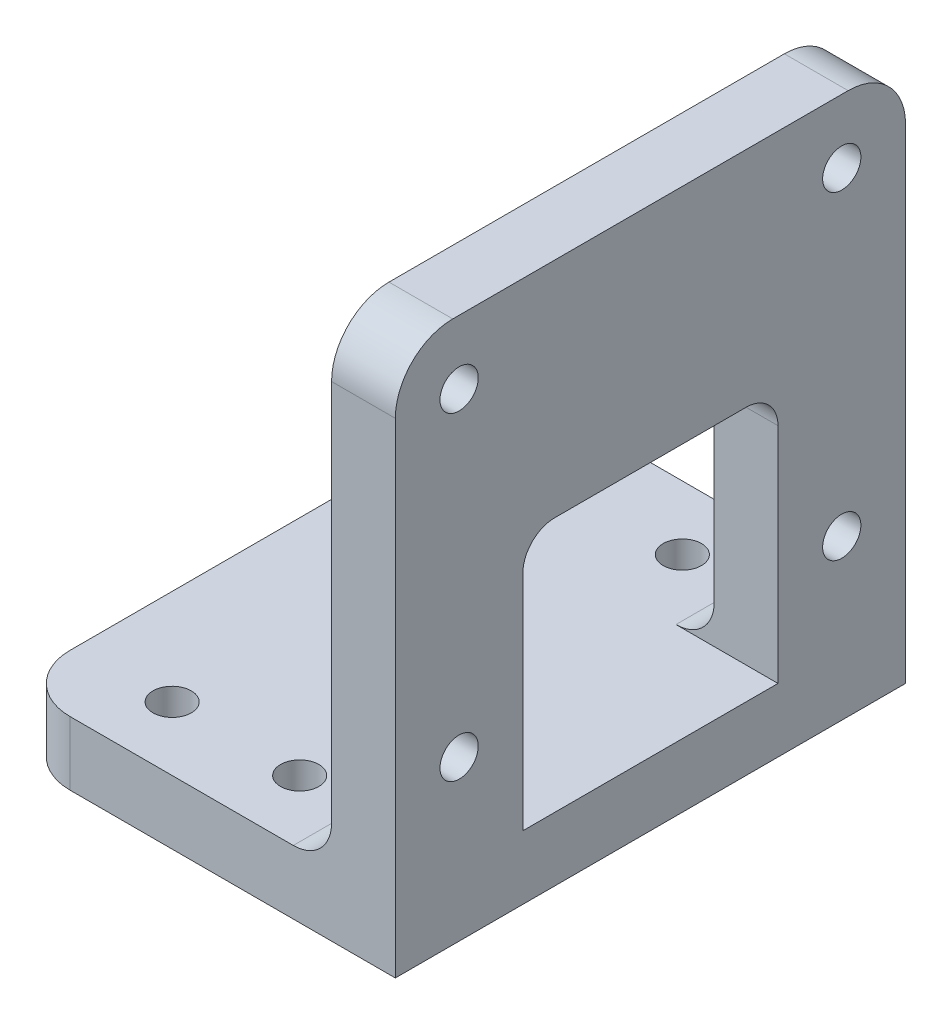
ISO-10303-21;
HEADER;
FILE_DESCRIPTION(('STEP AP214'),'2;1');
FILE_NAME('part.step','',(''),(''),'','','');
FILE_SCHEMA(('AUTOMOTIVE_DESIGN { 1 0 10303 214 1 1 1 1 }'));
ENDSEC;
DATA;
#1=APPLICATION_CONTEXT('core data for automotive mechanical design processes');
#2=APPLICATION_PROTOCOL_DEFINITION('international standard','automotive_design',2000,#1);
#3=PRODUCT_CONTEXT('',#1,'mechanical');
#4=PRODUCT('Part','Part','',(#3));
#5=PRODUCT_RELATED_PRODUCT_CATEGORY('part','',(#4));
#6=PRODUCT_DEFINITION_FORMATION('','',#4);
#7=PRODUCT_DEFINITION_CONTEXT('part definition',#1,'design');
#8=PRODUCT_DEFINITION('design','',#6,#7);
#9=PRODUCT_DEFINITION_SHAPE('','',#8);
#10=(LENGTH_UNIT() NAMED_UNIT(*) SI_UNIT(.MILLI.,.METRE.));
#11=(NAMED_UNIT(*) PLANE_ANGLE_UNIT() SI_UNIT($,.RADIAN.));
#12=(NAMED_UNIT(*) SI_UNIT($,.STERADIAN.) SOLID_ANGLE_UNIT());
#13=UNCERTAINTY_MEASURE_WITH_UNIT(LENGTH_MEASURE(1.E-05),#10,'distance_accuracy_value','');
#14=(GEOMETRIC_REPRESENTATION_CONTEXT(3) GLOBAL_UNCERTAINTY_ASSIGNED_CONTEXT((#13)) GLOBAL_UNIT_ASSIGNED_CONTEXT((#10,
#11,#12)) REPRESENTATION_CONTEXT('',''));
#15=CARTESIAN_POINT('',(0.,0.,0.));
#16=DIRECTION('',(0.,0.,1.));
#17=DIRECTION('',(1.,0.,0.));
#18=AXIS2_PLACEMENT_3D('',#15,#16,#17);
#19=CARTESIAN_POINT('',(4.5,5.,-35.5));
#20=DIRECTION('',(0.,-1.,0.));
#21=DIRECTION('',(0.,0.,-1.));
#22=AXIS2_PLACEMENT_3D('',#19,#20,#21);
#23=PLANE('',#22);
#24=DIRECTION('',(1.,0.,0.));
#25=VECTOR('',#24,1.);
#26=CARTESIAN_POINT('',(4.5,5.,0.));
#27=LINE('',#26,#25);
#28=CARTESIAN_POINT('',(4.5,5.,0.));
#29=VERTEX_POINT('',#28);
#30=CARTESIAN_POINT('',(22.,5.,0.));
#31=VERTEX_POINT('',#30);
#32=EDGE_CURVE('E315',#29,#31,#27,.T.);
#33=ORIENTED_EDGE('',*,*,#32,.T.);
#34=DIRECTION('',(0.,0.,-1.));
#35=VECTOR('',#34,1.);
#36=CARTESIAN_POINT('',(22.,5.,-35.5));
#37=LINE('',#36,#35);
#38=CARTESIAN_POINT('',(22.,5.,-10.));
#39=VERTEX_POINT('',#38);
#40=EDGE_CURVE('E182',#31,#39,#37,.T.);
#41=ORIENTED_EDGE('',*,*,#40,.T.);
#42=DIRECTION('',(-1.,0.,0.));
#43=VECTOR('',#42,1.);
#44=CARTESIAN_POINT('',(30.,5.,-10.));
#45=LINE('',#44,#43);
#46=CARTESIAN_POINT('',(30.,5.,-10.));
#47=VERTEX_POINT('',#46);
#48=EDGE_CURVE('E167',#47,#39,#45,.T.);
#49=ORIENTED_EDGE('',*,*,#48,.F.);
#50=DIRECTION('',(0.,0.,-1.));
#51=VECTOR('',#50,1.);
#52=CARTESIAN_POINT('',(30.,5.,-30.));
#53=LINE('',#52,#51);
#54=CARTESIAN_POINT('',(30.,5.,-30.));
#55=VERTEX_POINT('',#54);
#56=EDGE_CURVE('E173',#47,#55,#53,.T.);
#57=ORIENTED_EDGE('',*,*,#56,.T.);
#58=DIRECTION('',(-1.,0.,0.));
#59=VECTOR('',#58,1.);
#60=CARTESIAN_POINT('',(30.,5.,-30.));
#61=LINE('',#60,#59);
#62=CARTESIAN_POINT('',(22.,5.,-30.));
#63=VERTEX_POINT('',#62);
#64=EDGE_CURVE('E184',#55,#63,#61,.T.);
#65=ORIENTED_EDGE('',*,*,#64,.T.);
#66=DIRECTION('',(0.,0.,-1.));
#67=VECTOR('',#66,1.);
#68=CARTESIAN_POINT('',(22.,5.,-35.5));
#69=LINE('',#68,#67);
#70=CARTESIAN_POINT('',(22.,5.,-40.));
#71=VERTEX_POINT('',#70);
#72=EDGE_CURVE('E337',#63,#71,#69,.T.);
#73=ORIENTED_EDGE('',*,*,#72,.T.);
#74=DIRECTION('',(-1.,0.,0.));
#75=VECTOR('',#74,1.);
#76=CARTESIAN_POINT('',(4.5,5.,-40.));
#77=LINE('',#76,#75);
#78=CARTESIAN_POINT('',(4.5,5.,-40.));
#79=VERTEX_POINT('',#78);
#80=EDGE_CURVE('E306',#71,#79,#77,.T.);
#81=ORIENTED_EDGE('',*,*,#80,.T.);
#82=CARTESIAN_POINT('',(4.5,5.,-35.5));
#83=DIRECTION('',(0.,1.,0.));
#84=DIRECTION('',(0.,0.,-1.));
#85=AXIS2_PLACEMENT_3D('',#82,#83,#84);
#86=CIRCLE('',#85,4.5);
#87=CARTESIAN_POINT('',(0.,5.,-35.5));
#88=VERTEX_POINT('',#87);
#89=EDGE_CURVE('E308',#79,#88,#86,.T.);
#90=ORIENTED_EDGE('',*,*,#89,.T.);
#91=DIRECTION('',(0.,0.,1.));
#92=VECTOR('',#91,1.);
#93=CARTESIAN_POINT('',(0.,5.,-4.5));
#94=LINE('',#93,#92);
#95=CARTESIAN_POINT('',(0.,5.,-4.5));
#96=VERTEX_POINT('',#95);
#97=EDGE_CURVE('E311',#88,#96,#94,.T.);
#98=ORIENTED_EDGE('',*,*,#97,.T.);
#99=CARTESIAN_POINT('',(4.5,5.,-4.5));
#100=DIRECTION('',(0.,1.,0.));
#101=DIRECTION('',(0.,0.,1.));
#102=AXIS2_PLACEMENT_3D('',#99,#100,#101);
#103=CIRCLE('',#102,4.5);
#104=EDGE_CURVE('E313',#96,#29,#103,.T.);
#105=ORIENTED_EDGE('',*,*,#104,.T.);
#106=EDGE_LOOP('',(#33,#41,#49,#57,#65,#73,#81,#90,#98,#105));
#107=FACE_BOUND('',#106,.T.);
#108=CARTESIAN_POINT('',(7.5,5.,-35.));
#109=DIRECTION('',(0.,1.,0.));
#110=DIRECTION('',(0.,0.,1.));
#111=AXIS2_PLACEMENT_3D('',#108,#109,#110);
#112=CIRCLE('',#111,1.5);
#113=CARTESIAN_POINT('',(7.5,5.,-33.5));
#114=VERTEX_POINT('',#113);
#115=EDGE_CURVE('E300',#114,#114,#112,.T.);
#116=ORIENTED_EDGE('',*,*,#115,.F.);
#117=EDGE_LOOP('',(#116));
#118=FACE_BOUND('',#117,.T.);
#119=CARTESIAN_POINT('',(17.5,5.,-35.));
#120=DIRECTION('',(0.,1.,0.));
#121=DIRECTION('',(0.,0.,1.));
#122=AXIS2_PLACEMENT_3D('',#119,#120,#121);
#123=CIRCLE('',#122,1.5);
#124=CARTESIAN_POINT('',(17.5,5.,-33.5));
#125=VERTEX_POINT('',#124);
#126=EDGE_CURVE('E294',#125,#125,#123,.T.);
#127=ORIENTED_EDGE('',*,*,#126,.F.);
#128=EDGE_LOOP('',(#127));
#129=FACE_BOUND('',#128,.T.);
#130=CARTESIAN_POINT('',(17.5,5.,-5.00000000000001));
#131=DIRECTION('',(0.,1.,0.));
#132=DIRECTION('',(0.,0.,-1.));
#133=AXIS2_PLACEMENT_3D('',#130,#131,#132);
#134=CIRCLE('',#133,1.5);
#135=CARTESIAN_POINT('',(17.5,5.,-6.50000000000001));
#136=VERTEX_POINT('',#135);
#137=EDGE_CURVE('E288',#136,#136,#134,.T.);
#138=ORIENTED_EDGE('',*,*,#137,.F.);
#139=EDGE_LOOP('',(#138));
#140=FACE_BOUND('',#139,.T.);
#141=CARTESIAN_POINT('',(7.5,5.,-5.));
#142=DIRECTION('',(0.,1.,0.));
#143=DIRECTION('',(0.,0.,-1.));
#144=AXIS2_PLACEMENT_3D('',#141,#142,#143);
#145=CIRCLE('',#144,1.5);
#146=CARTESIAN_POINT('',(7.5,5.,-6.50000000000001));
#147=VERTEX_POINT('',#146);
#148=EDGE_CURVE('E282',#147,#147,#145,.T.);
#149=ORIENTED_EDGE('',*,*,#148,.F.);
#150=EDGE_LOOP('',(#149));
#151=FACE_BOUND('',#150,.T.);
#152=ADVANCED_FACE('F39',(#107,#118,#129,#140,#151),#23,.F.);
#153=CARTESIAN_POINT('',(4.5,0.,-35.5));
#154=DIRECTION('',(0.,-1.,0.));
#155=DIRECTION('',(0.,0.,-1.));
#156=AXIS2_PLACEMENT_3D('',#153,#154,#155);
#157=PLANE('',#156);
#158=CARTESIAN_POINT('',(17.5,0.,-5.00000000000001));
#159=DIRECTION('',(0.,1.,0.));
#160=DIRECTION('',(0.,0.,-1.));
#161=AXIS2_PLACEMENT_3D('',#158,#159,#160);
#162=CIRCLE('',#161,1.5);
#163=CARTESIAN_POINT('',(17.5,0.,-6.50000000000001));
#164=VERTEX_POINT('',#163);
#165=EDGE_CURVE('E285',#164,#164,#162,.T.);
#166=ORIENTED_EDGE('',*,*,#165,.T.);
#167=EDGE_LOOP('',(#166));
#168=FACE_BOUND('',#167,.T.);
#169=CARTESIAN_POINT('',(7.5,0.,-35.));
#170=DIRECTION('',(0.,1.,0.));
#171=DIRECTION('',(0.,0.,1.));
#172=AXIS2_PLACEMENT_3D('',#169,#170,#171);
#173=CIRCLE('',#172,1.5);
#174=CARTESIAN_POINT('',(7.5,0.,-33.5));
#175=VERTEX_POINT('',#174);
#176=EDGE_CURVE('E297',#175,#175,#173,.T.);
#177=ORIENTED_EDGE('',*,*,#176,.T.);
#178=EDGE_LOOP('',(#177));
#179=FACE_BOUND('',#178,.T.);
#180=DIRECTION('',(-1.,0.,0.));
#181=VECTOR('',#180,1.);
#182=CARTESIAN_POINT('',(4.5,0.,-40.));
#183=LINE('',#182,#181);
#184=CARTESIAN_POINT('',(30.,0.,-40.));
#185=VERTEX_POINT('',#184);
#186=CARTESIAN_POINT('',(4.5,0.,-40.));
#187=VERTEX_POINT('',#186);
#188=EDGE_CURVE('E303',#185,#187,#183,.T.);
#189=ORIENTED_EDGE('',*,*,#188,.F.);
#190=DIRECTION('',(0.,0.,-1.));
#191=VECTOR('',#190,1.);
#192=CARTESIAN_POINT('',(30.,0.,0.));
#193=LINE('',#192,#191);
#194=CARTESIAN_POINT('',(30.,0.,0.));
#195=VERTEX_POINT('',#194);
#196=EDGE_CURVE('E248',#195,#185,#193,.T.);
#197=ORIENTED_EDGE('',*,*,#196,.F.);
#198=DIRECTION('',(1.,0.,0.));
#199=VECTOR('',#198,1.);
#200=CARTESIAN_POINT('',(4.5,0.,0.));
#201=LINE('',#200,#199);
#202=CARTESIAN_POINT('',(4.5,0.,0.));
#203=VERTEX_POINT('',#202);
#204=EDGE_CURVE('E309',#203,#195,#201,.T.);
#205=ORIENTED_EDGE('',*,*,#204,.F.);
#206=CARTESIAN_POINT('',(4.5,0.,-4.5));
#207=DIRECTION('',(0.,1.,0.));
#208=DIRECTION('',(0.,0.,1.));
#209=AXIS2_PLACEMENT_3D('',#206,#207,#208);
#210=CIRCLE('',#209,4.5);
#211=CARTESIAN_POINT('',(0.,0.,-4.5));
#212=VERTEX_POINT('',#211);
#213=EDGE_CURVE('E323',#212,#203,#210,.T.);
#214=ORIENTED_EDGE('',*,*,#213,.F.);
#215=DIRECTION('',(0.,0.,1.));
#216=VECTOR('',#215,1.);
#217=CARTESIAN_POINT('',(0.,0.,-4.5));
#218=LINE('',#217,#216);
#219=CARTESIAN_POINT('',(0.,0.,-35.5));
#220=VERTEX_POINT('',#219);
#221=EDGE_CURVE('E321',#220,#212,#218,.T.);
#222=ORIENTED_EDGE('',*,*,#221,.F.);
#223=CARTESIAN_POINT('',(4.5,0.,-35.5));
#224=DIRECTION('',(0.,1.,0.));
#225=DIRECTION('',(0.,0.,-1.));
#226=AXIS2_PLACEMENT_3D('',#223,#224,#225);
#227=CIRCLE('',#226,4.5);
#228=EDGE_CURVE('E319',#187,#220,#227,.T.);
#229=ORIENTED_EDGE('',*,*,#228,.F.);
#230=EDGE_LOOP('',(#189,#197,#205,#214,#222,#229));
#231=FACE_BOUND('',#230,.T.);
#232=CARTESIAN_POINT('',(17.5,0.,-35.));
#233=DIRECTION('',(0.,1.,0.));
#234=DIRECTION('',(0.,0.,1.));
#235=AXIS2_PLACEMENT_3D('',#232,#233,#234);
#236=CIRCLE('',#235,1.5);
#237=CARTESIAN_POINT('',(17.5,0.,-33.5));
#238=VERTEX_POINT('',#237);
#239=EDGE_CURVE('E291',#238,#238,#236,.T.);
#240=ORIENTED_EDGE('',*,*,#239,.T.);
#241=EDGE_LOOP('',(#240));
#242=FACE_BOUND('',#241,.T.);
#243=CARTESIAN_POINT('',(7.5,0.,-5.));
#244=DIRECTION('',(0.,1.,0.));
#245=DIRECTION('',(0.,0.,-1.));
#246=AXIS2_PLACEMENT_3D('',#243,#244,#245);
#247=CIRCLE('',#246,1.5);
#248=CARTESIAN_POINT('',(7.5,0.,-6.50000000000001));
#249=VERTEX_POINT('',#248);
#250=EDGE_CURVE('E281',#249,#249,#247,.T.);
#251=ORIENTED_EDGE('',*,*,#250,.T.);
#252=EDGE_LOOP('',(#251));
#253=FACE_BOUND('',#252,.T.);
#254=ADVANCED_FACE('F390',(#168,#179,#231,#242,#253),#157,.T.);
#255=CARTESIAN_POINT('',(4.5,5.,-40.));
#256=DIRECTION('',(0.,0.,1.));
#257=DIRECTION('',(1.,0.,0.));
#258=AXIS2_PLACEMENT_3D('',#255,#256,#257);
#259=PLANE('',#258);
#260=ORIENTED_EDGE('',*,*,#188,.T.);
#261=DIRECTION('',(0.,-1.,0.));
#262=VECTOR('',#261,1.);
#263=CARTESIAN_POINT('',(4.5,5.,-40.));
#264=LINE('',#263,#262);
#265=EDGE_CURVE('E334',#79,#187,#264,.T.);
#266=ORIENTED_EDGE('',*,*,#265,.F.);
#267=ORIENTED_EDGE('',*,*,#80,.F.);
#268=CARTESIAN_POINT('',(22.,8.,-40.));
#269=DIRECTION('',(0.,0.,1.));
#270=DIRECTION('',(1.,0.,0.));
#271=AXIS2_PLACEMENT_3D('',#268,#269,#270);
#272=CIRCLE('',#271,3.);
#273=CARTESIAN_POINT('',(25.,8.,-40.));
#274=VERTEX_POINT('',#273);
#275=EDGE_CURVE('E47',#71,#274,#272,.T.);
#276=ORIENTED_EDGE('',*,*,#275,.T.);
#277=DIRECTION('',(0.,1.,0.));
#278=VECTOR('',#277,1.);
#279=CARTESIAN_POINT('',(25.,0.,-40.));
#280=LINE('',#279,#278);
#281=CARTESIAN_POINT('',(25.,38.,-40.));
#282=VERTEX_POINT('',#281);
#283=EDGE_CURVE('E263',#274,#282,#280,.T.);
#284=ORIENTED_EDGE('',*,*,#283,.T.);
#285=DIRECTION('',(-1.,0.,0.));
#286=VECTOR('',#285,1.);
#287=CARTESIAN_POINT('',(30.,38.,-40.));
#288=LINE('',#287,#286);
#289=CARTESIAN_POINT('',(30.,38.,-40.));
#290=VERTEX_POINT('',#289);
#291=EDGE_CURVE('E278',#290,#282,#288,.T.);
#292=ORIENTED_EDGE('',*,*,#291,.F.);
#293=DIRECTION('',(0.,1.,0.));
#294=VECTOR('',#293,1.);
#295=CARTESIAN_POINT('',(30.,0.,-40.));
#296=LINE('',#295,#294);
#297=EDGE_CURVE('E252',#185,#290,#296,.T.);
#298=ORIENTED_EDGE('',*,*,#297,.F.);
#299=EDGE_LOOP('',(#260,#266,#267,#276,#284,#292,#298));
#300=FACE_BOUND('',#299,.T.);
#301=ADVANCED_FACE('F348',(#300),#259,.F.);
#302=CARTESIAN_POINT('',(4.5,5.,-35.5));
#303=DIRECTION('',(0.,-1.,0.));
#304=DIRECTION('',(0.,0.,-1.));
#305=AXIS2_PLACEMENT_3D('',#302,#303,#304);
#306=CYLINDRICAL_SURFACE('',#305,4.5);
#307=ORIENTED_EDGE('',*,*,#228,.T.);
#308=DIRECTION('',(0.,-1.,0.));
#309=VECTOR('',#308,1.);
#310=CARTESIAN_POINT('',(0.,5.,-35.5));
#311=LINE('',#310,#309);
#312=EDGE_CURVE('E331',#88,#220,#311,.T.);
#313=ORIENTED_EDGE('',*,*,#312,.F.);
#314=ORIENTED_EDGE('',*,*,#89,.F.);
#315=ORIENTED_EDGE('',*,*,#265,.T.);
#316=EDGE_LOOP('',(#307,#313,#314,#315));
#317=FACE_BOUND('',#316,.T.);
#318=ADVANCED_FACE('F411',(#317),#306,.T.);
#319=CARTESIAN_POINT('',(0.,5.,-4.5));
#320=DIRECTION('',(1.,0.,0.));
#321=DIRECTION('',(0.,0.,-1.));
#322=AXIS2_PLACEMENT_3D('',#319,#320,#321);
#323=PLANE('',#322);
#324=ORIENTED_EDGE('',*,*,#221,.T.);
#325=DIRECTION('',(0.,-1.,0.));
#326=VECTOR('',#325,1.);
#327=CARTESIAN_POINT('',(0.,5.,-4.5));
#328=LINE('',#327,#326);
#329=EDGE_CURVE('E328',#96,#212,#328,.T.);
#330=ORIENTED_EDGE('',*,*,#329,.F.);
#331=ORIENTED_EDGE('',*,*,#97,.F.);
#332=ORIENTED_EDGE('',*,*,#312,.T.);
#333=EDGE_LOOP('',(#324,#330,#331,#332));
#334=FACE_BOUND('',#333,.T.);
#335=ADVANCED_FACE('F414',(#334),#323,.F.);
#336=CARTESIAN_POINT('',(4.5,5.,-4.5));
#337=DIRECTION('',(0.,-1.,0.));
#338=DIRECTION('',(0.,0.,-1.));
#339=AXIS2_PLACEMENT_3D('',#336,#337,#338);
#340=CYLINDRICAL_SURFACE('',#339,4.5);
#341=ORIENTED_EDGE('',*,*,#213,.T.);
#342=DIRECTION('',(0.,-1.,0.));
#343=VECTOR('',#342,1.);
#344=CARTESIAN_POINT('',(4.5,5.,0.));
#345=LINE('',#344,#343);
#346=EDGE_CURVE('E317',#29,#203,#345,.T.);
#347=ORIENTED_EDGE('',*,*,#346,.F.);
#348=ORIENTED_EDGE('',*,*,#104,.F.);
#349=ORIENTED_EDGE('',*,*,#329,.T.);
#350=EDGE_LOOP('',(#341,#347,#348,#349));
#351=FACE_BOUND('',#350,.T.);
#352=ADVANCED_FACE('F384',(#351),#340,.T.);
#353=CARTESIAN_POINT('',(4.5,5.,0.));
#354=DIRECTION('',(0.,0.,-1.));
#355=DIRECTION('',(-1.,0.,0.));
#356=AXIS2_PLACEMENT_3D('',#353,#354,#355);
#357=PLANE('',#356);
#358=ORIENTED_EDGE('',*,*,#204,.T.);
#359=DIRECTION('',(0.,-1.,0.));
#360=VECTOR('',#359,1.);
#361=CARTESIAN_POINT('',(30.,0.,0.));
#362=LINE('',#361,#360);
#363=CARTESIAN_POINT('',(30.,38.,0.));
#364=VERTEX_POINT('',#363);
#365=EDGE_CURVE('E245',#364,#195,#362,.T.);
#366=ORIENTED_EDGE('',*,*,#365,.F.);
#367=DIRECTION('',(-1.,0.,0.));
#368=VECTOR('',#367,1.);
#369=CARTESIAN_POINT('',(30.,38.,0.));
#370=LINE('',#369,#368);
#371=CARTESIAN_POINT('',(25.,38.,0.));
#372=VERTEX_POINT('',#371);
#373=EDGE_CURVE('E260',#364,#372,#370,.T.);
#374=ORIENTED_EDGE('',*,*,#373,.T.);
#375=DIRECTION('',(0.,-1.,0.));
#376=VECTOR('',#375,1.);
#377=CARTESIAN_POINT('',(25.,0.,0.));
#378=LINE('',#377,#376);
#379=CARTESIAN_POINT('',(25.,8.,0.));
#380=VERTEX_POINT('',#379);
#381=EDGE_CURVE('E242',#372,#380,#378,.T.);
#382=ORIENTED_EDGE('',*,*,#381,.T.);
#383=CARTESIAN_POINT('',(22.,8.,0.));
#384=DIRECTION('',(0.,0.,-1.));
#385=DIRECTION('',(-1.,0.,0.));
#386=AXIS2_PLACEMENT_3D('',#383,#384,#385);
#387=CIRCLE('',#386,3.);
#388=EDGE_CURVE('E345',#380,#31,#387,.T.);
#389=ORIENTED_EDGE('',*,*,#388,.T.);
#390=ORIENTED_EDGE('',*,*,#32,.F.);
#391=ORIENTED_EDGE('',*,*,#346,.T.);
#392=EDGE_LOOP('',(#358,#366,#374,#382,#389,#390,#391));
#393=FACE_BOUND('',#392,.T.);
#394=ADVANCED_FACE('F378',(#393),#357,.F.);
#395=CARTESIAN_POINT('',(7.5,5.,-35.));
#396=DIRECTION('',(0.,-1.,0.));
#397=DIRECTION('',(0.,0.,-1.));
#398=AXIS2_PLACEMENT_3D('',#395,#396,#397);
#399=CYLINDRICAL_SURFACE('',#398,1.5);
#400=ORIENTED_EDGE('',*,*,#115,.T.);
#401=EDGE_LOOP('',(#400));
#402=FACE_BOUND('',#401,.T.);
#403=ORIENTED_EDGE('',*,*,#176,.F.);
#404=EDGE_LOOP('',(#403));
#405=FACE_BOUND('',#404,.T.);
#406=ADVANCED_FACE('F433',(#402,#405),#399,.F.);
#407=CARTESIAN_POINT('',(17.5,5.,-35.));
#408=DIRECTION('',(0.,-1.,0.));
#409=DIRECTION('',(0.,0.,-1.));
#410=AXIS2_PLACEMENT_3D('',#407,#408,#409);
#411=CYLINDRICAL_SURFACE('',#410,1.5);
#412=ORIENTED_EDGE('',*,*,#126,.T.);
#413=EDGE_LOOP('',(#412));
#414=FACE_BOUND('',#413,.T.);
#415=ORIENTED_EDGE('',*,*,#239,.F.);
#416=EDGE_LOOP('',(#415));
#417=FACE_BOUND('',#416,.T.);
#418=ADVANCED_FACE('F441',(#414,#417),#411,.F.);
#419=CARTESIAN_POINT('',(17.5,5.,-5.00000000000001));
#420=DIRECTION('',(0.,-1.,0.));
#421=DIRECTION('',(0.,0.,-1.));
#422=AXIS2_PLACEMENT_3D('',#419,#420,#421);
#423=CYLINDRICAL_SURFACE('',#422,1.5);
#424=ORIENTED_EDGE('',*,*,#137,.T.);
#425=EDGE_LOOP('',(#424));
#426=FACE_BOUND('',#425,.T.);
#427=ORIENTED_EDGE('',*,*,#165,.F.);
#428=EDGE_LOOP('',(#427));
#429=FACE_BOUND('',#428,.T.);
#430=ADVANCED_FACE('F446',(#426,#429),#423,.F.);
#431=CARTESIAN_POINT('',(7.5,5.,-5.));
#432=DIRECTION('',(0.,-1.,0.));
#433=DIRECTION('',(0.,0.,-1.));
#434=AXIS2_PLACEMENT_3D('',#431,#432,#433);
#435=CYLINDRICAL_SURFACE('',#434,1.5);
#436=ORIENTED_EDGE('',*,*,#148,.T.);
#437=EDGE_LOOP('',(#436));
#438=FACE_BOUND('',#437,.T.);
#439=ORIENTED_EDGE('',*,*,#250,.F.);
#440=EDGE_LOOP('',(#439));
#441=FACE_BOUND('',#440,.T.);
#442=ADVANCED_FACE('F459',(#438,#441),#435,.F.);
#443=CARTESIAN_POINT('',(25.,38.,-4.49999999999998));
#444=DIRECTION('',(-1.,0.,0.));
#445=DIRECTION('',(0.,0.,1.));
#446=AXIS2_PLACEMENT_3D('',#443,#444,#445);
#447=PLANE('',#446);
#448=CARTESIAN_POINT('',(25.,37.5,-35.));
#449=DIRECTION('',(1.,0.,0.));
#450=DIRECTION('',(0.,0.,1.));
#451=AXIS2_PLACEMENT_3D('',#448,#449,#450);
#452=CIRCLE('',#451,1.5);
#453=CARTESIAN_POINT('',(25.,37.5,-33.5));
#454=VERTEX_POINT('',#453);
#455=EDGE_CURVE('E183',#454,#454,#452,.T.);
#456=ORIENTED_EDGE('',*,*,#455,.T.);
#457=EDGE_LOOP('',(#456));
#458=FACE_BOUND('',#457,.T.);
#459=CARTESIAN_POINT('',(25.,12.5,-5.));
#460=DIRECTION('',(1.,0.,0.));
#461=DIRECTION('',(0.,0.,-1.));
#462=AXIS2_PLACEMENT_3D('',#459,#460,#461);
#463=CIRCLE('',#462,1.5);
#464=CARTESIAN_POINT('',(25.,12.5,-6.5));
#465=VERTEX_POINT('',#464);
#466=EDGE_CURVE('E230',#465,#465,#463,.T.);
#467=ORIENTED_EDGE('',*,*,#466,.T.);
#468=EDGE_LOOP('',(#467));
#469=FACE_BOUND('',#468,.T.);
#470=CARTESIAN_POINT('',(25.,37.5,-5.));
#471=DIRECTION('',(1.,0.,0.));
#472=DIRECTION('',(0.,0.,-1.));
#473=AXIS2_PLACEMENT_3D('',#470,#471,#472);
#474=CIRCLE('',#473,1.5);
#475=CARTESIAN_POINT('',(25.,37.5,-6.5));
#476=VERTEX_POINT('',#475);
#477=EDGE_CURVE('E236',#476,#476,#474,.T.);
#478=ORIENTED_EDGE('',*,*,#477,.T.);
#479=EDGE_LOOP('',(#478));
#480=FACE_BOUND('',#479,.T.);
#481=CARTESIAN_POINT('',(25.,12.5,-35.));
#482=DIRECTION('',(1.,0.,0.));
#483=DIRECTION('',(0.,0.,1.));
#484=AXIS2_PLACEMENT_3D('',#481,#482,#483);
#485=CIRCLE('',#484,1.5);
#486=CARTESIAN_POINT('',(25.,12.5,-33.5));
#487=VERTEX_POINT('',#486);
#488=EDGE_CURVE('E224',#487,#487,#485,.T.);
#489=ORIENTED_EDGE('',*,*,#488,.T.);
#490=EDGE_LOOP('',(#489));
#491=FACE_BOUND('',#490,.T.);
#492=DIRECTION('',(0.,-1.,0.));
#493=VECTOR('',#492,1.);
#494=CARTESIAN_POINT('',(25.,22.5,-10.));
#495=LINE('',#494,#493);
#496=CARTESIAN_POINT('',(25.,22.5,-10.));
#497=VERTEX_POINT('',#496);
#498=CARTESIAN_POINT('',(25.,8.,-10.));
#499=VERTEX_POINT('',#498);
#500=EDGE_CURVE('E200',#497,#499,#495,.T.);
#501=ORIENTED_EDGE('',*,*,#500,.T.);
#502=DIRECTION('',(0.,0.,-1.));
#503=VECTOR('',#502,1.);
#504=CARTESIAN_POINT('',(25.,8.,-4.49999999999998));
#505=LINE('',#504,#503);
#506=EDGE_CURVE('E342',#499,#380,#505,.F.);
#507=ORIENTED_EDGE('',*,*,#506,.T.);
#508=ORIENTED_EDGE('',*,*,#381,.F.);
#509=CARTESIAN_POINT('',(25.,38.,-4.49999999999998));
#510=DIRECTION('',(1.,0.,0.));
#511=DIRECTION('',(0.,0.,1.));
#512=AXIS2_PLACEMENT_3D('',#509,#510,#511);
#513=CIRCLE('',#512,4.49999999999999);
#514=CARTESIAN_POINT('',(25.,42.5,-4.49999999999999));
#515=VERTEX_POINT('',#514);
#516=EDGE_CURVE('E249',#515,#372,#513,.T.);
#517=ORIENTED_EDGE('',*,*,#516,.F.);
#518=DIRECTION('',(0.,0.,1.));
#519=VECTOR('',#518,1.);
#520=CARTESIAN_POINT('',(25.,42.5,-4.49999999999999));
#521=LINE('',#520,#519);
#522=CARTESIAN_POINT('',(25.,42.5,-35.5));
#523=VERTEX_POINT('',#522);
#524=EDGE_CURVE('E267',#523,#515,#521,.T.);
#525=ORIENTED_EDGE('',*,*,#524,.F.);
#526=CARTESIAN_POINT('',(25.,38.,-35.5));
#527=DIRECTION('',(1.,0.,0.));
#528=DIRECTION('',(0.,0.,-1.));
#529=AXIS2_PLACEMENT_3D('',#526,#527,#528);
#530=CIRCLE('',#529,4.49999999999999);
#531=EDGE_CURVE('E265',#282,#523,#530,.T.);
#532=ORIENTED_EDGE('',*,*,#531,.F.);
#533=ORIENTED_EDGE('',*,*,#283,.F.);
#534=DIRECTION('',(0.,0.,-1.));
#535=VECTOR('',#534,1.);
#536=CARTESIAN_POINT('',(25.,8.,-4.49999999999998));
#537=LINE('',#536,#535);
#538=CARTESIAN_POINT('',(25.,8.,-30.));
#539=VERTEX_POINT('',#538);
#540=EDGE_CURVE('E62',#274,#539,#537,.F.);
#541=ORIENTED_EDGE('',*,*,#540,.T.);
#542=DIRECTION('',(0.,1.,0.));
#543=VECTOR('',#542,1.);
#544=CARTESIAN_POINT('',(25.,22.5,-30.));
#545=LINE('',#544,#543);
#546=CARTESIAN_POINT('',(25.,22.5,-30.));
#547=VERTEX_POINT('',#546);
#548=EDGE_CURVE('E202',#539,#547,#545,.T.);
#549=ORIENTED_EDGE('',*,*,#548,.T.);
#550=CARTESIAN_POINT('',(25.,22.5,-27.5));
#551=DIRECTION('',(1.,0.,0.));
#552=DIRECTION('',(0.,0.,-1.));
#553=AXIS2_PLACEMENT_3D('',#550,#551,#552);
#554=CIRCLE('',#553,2.5);
#555=CARTESIAN_POINT('',(25.,25.,-27.5));
#556=VERTEX_POINT('',#555);
#557=EDGE_CURVE('E204',#547,#556,#554,.T.);
#558=ORIENTED_EDGE('',*,*,#557,.T.);
#559=DIRECTION('',(0.,0.,1.));
#560=VECTOR('',#559,1.);
#561=CARTESIAN_POINT('',(25.,25.,-27.5));
#562=LINE('',#561,#560);
#563=CARTESIAN_POINT('',(25.,25.,-12.5));
#564=VERTEX_POINT('',#563);
#565=EDGE_CURVE('E207',#556,#564,#562,.T.);
#566=ORIENTED_EDGE('',*,*,#565,.T.);
#567=CARTESIAN_POINT('',(25.,22.5,-12.5));
#568=DIRECTION('',(1.,0.,0.));
#569=DIRECTION('',(0.,0.,1.));
#570=AXIS2_PLACEMENT_3D('',#567,#568,#569);
#571=CIRCLE('',#570,2.5);
#572=EDGE_CURVE('E174',#564,#497,#571,.T.);
#573=ORIENTED_EDGE('',*,*,#572,.T.);
#574=EDGE_LOOP('',(#501,#507,#508,#517,#525,#532,#533,#541,#549,#558,#566,#573));
#575=FACE_BOUND('',#574,.T.);
#576=ADVANCED_FACE('F354',(#458,#469,#480,#491,#575),#447,.T.);
#577=CARTESIAN_POINT('',(30.,38.,-4.49999999999999));
#578=DIRECTION('',(-1.,0.,0.));
#579=DIRECTION('',(0.,0.,1.));
#580=AXIS2_PLACEMENT_3D('',#577,#578,#579);
#581=PLANE('',#580);
#582=CARTESIAN_POINT('',(30.,37.5,-35.));
#583=DIRECTION('',(1.,0.,0.));
#584=DIRECTION('',(0.,0.,1.));
#585=AXIS2_PLACEMENT_3D('',#582,#583,#584);
#586=CIRCLE('',#585,1.5);
#587=CARTESIAN_POINT('',(30.,37.5,-33.5));
#588=VERTEX_POINT('',#587);
#589=EDGE_CURVE('E221',#588,#588,#586,.T.);
#590=ORIENTED_EDGE('',*,*,#589,.F.);
#591=EDGE_LOOP('',(#590));
#592=FACE_BOUND('',#591,.T.);
#593=CARTESIAN_POINT('',(30.,12.5,-35.));
#594=DIRECTION('',(1.,0.,0.));
#595=DIRECTION('',(0.,0.,1.));
#596=AXIS2_PLACEMENT_3D('',#593,#594,#595);
#597=CIRCLE('',#596,1.5);
#598=CARTESIAN_POINT('',(30.,12.5,-33.5));
#599=VERTEX_POINT('',#598);
#600=EDGE_CURVE('E227',#599,#599,#597,.T.);
#601=ORIENTED_EDGE('',*,*,#600,.F.);
#602=EDGE_LOOP('',(#601));
#603=FACE_BOUND('',#602,.T.);
#604=CARTESIAN_POINT('',(30.,12.5,-5.));
#605=DIRECTION('',(1.,0.,0.));
#606=DIRECTION('',(0.,0.,-1.));
#607=AXIS2_PLACEMENT_3D('',#604,#605,#606);
#608=CIRCLE('',#607,1.5);
#609=CARTESIAN_POINT('',(30.,12.5,-6.5));
#610=VERTEX_POINT('',#609);
#611=EDGE_CURVE('E233',#610,#610,#608,.T.);
#612=ORIENTED_EDGE('',*,*,#611,.F.);
#613=EDGE_LOOP('',(#612));
#614=FACE_BOUND('',#613,.T.);
#615=CARTESIAN_POINT('',(30.,37.5,-5.));
#616=DIRECTION('',(1.,0.,0.));
#617=DIRECTION('',(0.,0.,-1.));
#618=AXIS2_PLACEMENT_3D('',#615,#616,#617);
#619=CIRCLE('',#618,1.5);
#620=CARTESIAN_POINT('',(30.,37.5,-6.5));
#621=VERTEX_POINT('',#620);
#622=EDGE_CURVE('E239',#621,#621,#619,.T.);
#623=ORIENTED_EDGE('',*,*,#622,.F.);
#624=EDGE_LOOP('',(#623));
#625=FACE_BOUND('',#624,.T.);
#626=ORIENTED_EDGE('',*,*,#365,.T.);
#627=ORIENTED_EDGE('',*,*,#196,.T.);
#628=ORIENTED_EDGE('',*,*,#297,.T.);
#629=CARTESIAN_POINT('',(30.,38.,-35.5));
#630=DIRECTION('',(1.,0.,0.));
#631=DIRECTION('',(0.,0.,-1.));
#632=AXIS2_PLACEMENT_3D('',#629,#630,#631);
#633=CIRCLE('',#632,4.49999999999999);
#634=CARTESIAN_POINT('',(30.,42.5,-35.5));
#635=VERTEX_POINT('',#634);
#636=EDGE_CURVE('E254',#290,#635,#633,.T.);
#637=ORIENTED_EDGE('',*,*,#636,.T.);
#638=DIRECTION('',(0.,0.,1.));
#639=VECTOR('',#638,1.);
#640=CARTESIAN_POINT('',(30.,42.5,-4.49999999999999));
#641=LINE('',#640,#639);
#642=CARTESIAN_POINT('',(30.,42.5,-4.49999999999999));
#643=VERTEX_POINT('',#642);
#644=EDGE_CURVE('E256',#635,#643,#641,.T.);
#645=ORIENTED_EDGE('',*,*,#644,.T.);
#646=CARTESIAN_POINT('',(30.,38.,-4.49999999999999));
#647=DIRECTION('',(1.,0.,0.));
#648=DIRECTION('',(0.,0.,1.));
#649=AXIS2_PLACEMENT_3D('',#646,#647,#648);
#650=CIRCLE('',#649,4.49999999999999);
#651=EDGE_CURVE('E258',#643,#364,#650,.T.);
#652=ORIENTED_EDGE('',*,*,#651,.T.);
#653=EDGE_LOOP('',(#626,#627,#628,#637,#645,#652));
#654=FACE_BOUND('',#653,.T.);
#655=DIRECTION('',(0.,-1.,0.));
#656=VECTOR('',#655,1.);
#657=CARTESIAN_POINT('',(30.,22.5,-10.));
#658=LINE('',#657,#656);
#659=CARTESIAN_POINT('',(30.,22.5,-10.));
#660=VERTEX_POINT('',#659);
#661=EDGE_CURVE('E164',#660,#47,#658,.T.);
#662=ORIENTED_EDGE('',*,*,#661,.F.);
#663=CARTESIAN_POINT('',(30.,22.5,-12.5));
#664=DIRECTION('',(1.,0.,0.));
#665=DIRECTION('',(0.,0.,1.));
#666=AXIS2_PLACEMENT_3D('',#663,#664,#665);
#667=CIRCLE('',#666,2.5);
#668=CARTESIAN_POINT('',(30.,25.,-12.5));
#669=VERTEX_POINT('',#668);
#670=EDGE_CURVE('E198',#669,#660,#667,.T.);
#671=ORIENTED_EDGE('',*,*,#670,.F.);
#672=DIRECTION('',(0.,0.,1.));
#673=VECTOR('',#672,1.);
#674=CARTESIAN_POINT('',(30.,25.,-27.5));
#675=LINE('',#674,#673);
#676=CARTESIAN_POINT('',(30.,25.,-27.5));
#677=VERTEX_POINT('',#676);
#678=EDGE_CURVE('E195',#677,#669,#675,.T.);
#679=ORIENTED_EDGE('',*,*,#678,.F.);
#680=CARTESIAN_POINT('',(30.,22.5,-27.5));
#681=DIRECTION('',(1.,0.,0.));
#682=DIRECTION('',(0.,0.,-1.));
#683=AXIS2_PLACEMENT_3D('',#680,#681,#682);
#684=CIRCLE('',#683,2.5);
#685=CARTESIAN_POINT('',(30.,22.5,-30.));
#686=VERTEX_POINT('',#685);
#687=EDGE_CURVE('E191',#686,#677,#684,.T.);
#688=ORIENTED_EDGE('',*,*,#687,.F.);
#689=DIRECTION('',(0.,1.,0.));
#690=VECTOR('',#689,1.);
#691=CARTESIAN_POINT('',(30.,22.5,-30.));
#692=LINE('',#691,#690);
#693=EDGE_CURVE('E189',#55,#686,#692,.T.);
#694=ORIENTED_EDGE('',*,*,#693,.F.);
#695=ORIENTED_EDGE('',*,*,#56,.F.);
#696=EDGE_LOOP('',(#662,#671,#679,#688,#694,#695));
#697=FACE_BOUND('',#696,.T.);
#698=ADVANCED_FACE('F187',(#592,#603,#614,#625,#654,#697),#581,.F.);
#699=CARTESIAN_POINT('',(30.,38.,-35.5));
#700=DIRECTION('',(-1.,0.,0.));
#701=DIRECTION('',(0.,0.,1.));
#702=AXIS2_PLACEMENT_3D('',#699,#700,#701);
#703=CYLINDRICAL_SURFACE('',#702,4.49999999999999);
#704=ORIENTED_EDGE('',*,*,#531,.T.);
#705=DIRECTION('',(-1.,0.,0.));
#706=VECTOR('',#705,1.);
#707=CARTESIAN_POINT('',(30.,42.5,-35.5));
#708=LINE('',#707,#706);
#709=EDGE_CURVE('E275',#635,#523,#708,.T.);
#710=ORIENTED_EDGE('',*,*,#709,.F.);
#711=ORIENTED_EDGE('',*,*,#636,.F.);
#712=ORIENTED_EDGE('',*,*,#291,.T.);
#713=EDGE_LOOP('',(#704,#710,#711,#712));
#714=FACE_BOUND('',#713,.T.);
#715=ADVANCED_FACE('F408',(#714),#703,.T.);
#716=CARTESIAN_POINT('',(30.,42.5,-4.49999999999999));
#717=DIRECTION('',(0.,-1.,0.));
#718=DIRECTION('',(0.,0.,-1.));
#719=AXIS2_PLACEMENT_3D('',#716,#717,#718);
#720=PLANE('',#719);
#721=ORIENTED_EDGE('',*,*,#524,.T.);
#722=DIRECTION('',(-1.,0.,0.));
#723=VECTOR('',#722,1.);
#724=CARTESIAN_POINT('',(30.,42.5,-4.49999999999999));
#725=LINE('',#724,#723);
#726=EDGE_CURVE('E272',#643,#515,#725,.T.);
#727=ORIENTED_EDGE('',*,*,#726,.F.);
#728=ORIENTED_EDGE('',*,*,#644,.F.);
#729=ORIENTED_EDGE('',*,*,#709,.T.);
#730=EDGE_LOOP('',(#721,#727,#728,#729));
#731=FACE_BOUND('',#730,.T.);
#732=ADVANCED_FACE('F404',(#731),#720,.F.);
#733=CARTESIAN_POINT('',(30.,38.,-4.49999999999999));
#734=DIRECTION('',(-1.,0.,0.));
#735=DIRECTION('',(0.,0.,1.));
#736=AXIS2_PLACEMENT_3D('',#733,#734,#735);
#737=CYLINDRICAL_SURFACE('',#736,4.49999999999999);
#738=ORIENTED_EDGE('',*,*,#516,.T.);
#739=ORIENTED_EDGE('',*,*,#373,.F.);
#740=ORIENTED_EDGE('',*,*,#651,.F.);
#741=ORIENTED_EDGE('',*,*,#726,.T.);
#742=EDGE_LOOP('',(#738,#739,#740,#741));
#743=FACE_BOUND('',#742,.T.);
#744=ADVANCED_FACE('F400',(#743),#737,.T.);
#745=CARTESIAN_POINT('',(30.,37.5,-5.));
#746=DIRECTION('',(-1.,0.,0.));
#747=DIRECTION('',(0.,0.,1.));
#748=AXIS2_PLACEMENT_3D('',#745,#746,#747);
#749=CYLINDRICAL_SURFACE('',#748,1.5);
#750=ORIENTED_EDGE('',*,*,#622,.T.);
#751=EDGE_LOOP('',(#750));
#752=FACE_BOUND('',#751,.T.);
#753=ORIENTED_EDGE('',*,*,#477,.F.);
#754=EDGE_LOOP('',(#753));
#755=FACE_BOUND('',#754,.T.);
#756=ADVANCED_FACE('F478',(#752,#755),#749,.F.);
#757=CARTESIAN_POINT('',(30.,12.5,-5.));
#758=DIRECTION('',(-1.,0.,0.));
#759=DIRECTION('',(0.,0.,1.));
#760=AXIS2_PLACEMENT_3D('',#757,#758,#759);
#761=CYLINDRICAL_SURFACE('',#760,1.5);
#762=ORIENTED_EDGE('',*,*,#611,.T.);
#763=EDGE_LOOP('',(#762));
#764=FACE_BOUND('',#763,.T.);
#765=ORIENTED_EDGE('',*,*,#466,.F.);
#766=EDGE_LOOP('',(#765));
#767=FACE_BOUND('',#766,.T.);
#768=ADVANCED_FACE('F485',(#764,#767),#761,.F.);
#769=CARTESIAN_POINT('',(30.,12.5,-35.));
#770=DIRECTION('',(-1.,0.,0.));
#771=DIRECTION('',(0.,0.,1.));
#772=AXIS2_PLACEMENT_3D('',#769,#770,#771);
#773=CYLINDRICAL_SURFACE('',#772,1.5);
#774=ORIENTED_EDGE('',*,*,#600,.T.);
#775=EDGE_LOOP('',(#774));
#776=FACE_BOUND('',#775,.T.);
#777=ORIENTED_EDGE('',*,*,#488,.F.);
#778=EDGE_LOOP('',(#777));
#779=FACE_BOUND('',#778,.T.);
#780=ADVANCED_FACE('F489',(#776,#779),#773,.F.);
#781=CARTESIAN_POINT('',(30.,37.5,-35.));
#782=DIRECTION('',(-1.,0.,0.));
#783=DIRECTION('',(0.,0.,1.));
#784=AXIS2_PLACEMENT_3D('',#781,#782,#783);
#785=CYLINDRICAL_SURFACE('',#784,1.5);
#786=ORIENTED_EDGE('',*,*,#589,.T.);
#787=EDGE_LOOP('',(#786));
#788=FACE_BOUND('',#787,.T.);
#789=ORIENTED_EDGE('',*,*,#455,.F.);
#790=EDGE_LOOP('',(#789));
#791=FACE_BOUND('',#790,.T.);
#792=ADVANCED_FACE('F493',(#788,#791),#785,.F.);
#793=CARTESIAN_POINT('',(30.,22.5,-10.));
#794=DIRECTION('',(0.,0.,-1.));
#795=DIRECTION('',(0.,1.,0.));
#796=AXIS2_PLACEMENT_3D('',#793,#794,#795);
#797=PLANE('',#796);
#798=ORIENTED_EDGE('',*,*,#500,.F.);
#799=DIRECTION('',(-1.,0.,0.));
#800=VECTOR('',#799,1.);
#801=CARTESIAN_POINT('',(30.,22.5,-10.));
#802=LINE('',#801,#800);
#803=EDGE_CURVE('E169',#660,#497,#802,.T.);
#804=ORIENTED_EDGE('',*,*,#803,.F.);
#805=ORIENTED_EDGE('',*,*,#661,.T.);
#806=ORIENTED_EDGE('',*,*,#48,.T.);
#807=CARTESIAN_POINT('',(22.,8.,-10.));
#808=DIRECTION('',(0.,0.,-1.));
#809=DIRECTION('',(0.,1.,0.));
#810=AXIS2_PLACEMENT_3D('',#807,#808,#809);
#811=CIRCLE('',#810,3.);
#812=EDGE_CURVE('E54',#39,#499,#811,.F.);
#813=ORIENTED_EDGE('',*,*,#812,.T.);
#814=EDGE_LOOP('',(#798,#804,#805,#806,#813));
#815=FACE_BOUND('',#814,.T.);
#816=ADVANCED_FACE('F166',(#815),#797,.T.);
#817=CARTESIAN_POINT('',(30.,22.5,-30.));
#818=DIRECTION('',(0.,0.,1.));
#819=DIRECTION('',(1.,0.,0.));
#820=AXIS2_PLACEMENT_3D('',#817,#818,#819);
#821=PLANE('',#820);
#822=ORIENTED_EDGE('',*,*,#548,.F.);
#823=CARTESIAN_POINT('',(22.,8.,-30.));
#824=DIRECTION('',(0.,0.,1.));
#825=DIRECTION('',(1.,0.,0.));
#826=AXIS2_PLACEMENT_3D('',#823,#824,#825);
#827=CIRCLE('',#826,3.);
#828=EDGE_CURVE('E11',#539,#63,#827,.F.);
#829=ORIENTED_EDGE('',*,*,#828,.T.);
#830=ORIENTED_EDGE('',*,*,#64,.F.);
#831=ORIENTED_EDGE('',*,*,#693,.T.);
#832=DIRECTION('',(-1.,0.,0.));
#833=VECTOR('',#832,1.);
#834=CARTESIAN_POINT('',(30.,22.5,-30.));
#835=LINE('',#834,#833);
#836=EDGE_CURVE('E217',#686,#547,#835,.T.);
#837=ORIENTED_EDGE('',*,*,#836,.T.);
#838=EDGE_LOOP('',(#822,#829,#830,#831,#837));
#839=FACE_BOUND('',#838,.T.);
#840=ADVANCED_FACE('F358',(#839),#821,.T.);
#841=CARTESIAN_POINT('',(30.,22.5,-27.5));
#842=DIRECTION('',(-1.,0.,0.));
#843=DIRECTION('',(0.,0.,1.));
#844=AXIS2_PLACEMENT_3D('',#841,#842,#843);
#845=CYLINDRICAL_SURFACE('',#844,2.5);
#846=ORIENTED_EDGE('',*,*,#557,.F.);
#847=ORIENTED_EDGE('',*,*,#836,.F.);
#848=ORIENTED_EDGE('',*,*,#687,.T.);
#849=DIRECTION('',(-1.,0.,0.));
#850=VECTOR('',#849,1.);
#851=CARTESIAN_POINT('',(30.,25.,-27.5));
#852=LINE('',#851,#850);
#853=EDGE_CURVE('E215',#677,#556,#852,.T.);
#854=ORIENTED_EDGE('',*,*,#853,.T.);
#855=EDGE_LOOP('',(#846,#847,#848,#854));
#856=FACE_BOUND('',#855,.T.);
#857=ADVANCED_FACE('F363',(#856),#845,.F.);
#858=CARTESIAN_POINT('',(30.,25.,-27.5));
#859=DIRECTION('',(0.,-1.,0.));
#860=DIRECTION('',(0.,0.,-1.));
#861=AXIS2_PLACEMENT_3D('',#858,#859,#860);
#862=PLANE('',#861);
#863=ORIENTED_EDGE('',*,*,#565,.F.);
#864=ORIENTED_EDGE('',*,*,#853,.F.);
#865=ORIENTED_EDGE('',*,*,#678,.T.);
#866=DIRECTION('',(-1.,0.,0.));
#867=VECTOR('',#866,1.);
#868=CARTESIAN_POINT('',(30.,25.,-12.5));
#869=LINE('',#868,#867);
#870=EDGE_CURVE('E213',#669,#564,#869,.T.);
#871=ORIENTED_EDGE('',*,*,#870,.T.);
#872=EDGE_LOOP('',(#863,#864,#865,#871));
#873=FACE_BOUND('',#872,.T.);
#874=ADVANCED_FACE('F367',(#873),#862,.T.);
#875=CARTESIAN_POINT('',(30.,22.5,-12.5));
#876=DIRECTION('',(-1.,0.,0.));
#877=DIRECTION('',(0.,0.,1.));
#878=AXIS2_PLACEMENT_3D('',#875,#876,#877);
#879=CYLINDRICAL_SURFACE('',#878,2.5);
#880=ORIENTED_EDGE('',*,*,#572,.F.);
#881=ORIENTED_EDGE('',*,*,#870,.F.);
#882=ORIENTED_EDGE('',*,*,#670,.T.);
#883=ORIENTED_EDGE('',*,*,#803,.T.);
#884=EDGE_LOOP('',(#880,#881,#882,#883));
#885=FACE_BOUND('',#884,.T.);
#886=ADVANCED_FACE('F370',(#885),#879,.F.);
#887=CARTESIAN_POINT('',(22.,8.,-35.5));
#888=DIRECTION('',(0.,0.,-1.));
#889=DIRECTION('',(-1.,0.,0.));
#890=AXIS2_PLACEMENT_3D('',#887,#888,#889);
#891=CYLINDRICAL_SURFACE('',#890,3.);
#892=ORIENTED_EDGE('',*,*,#388,.F.);
#893=ORIENTED_EDGE('',*,*,#506,.F.);
#894=ORIENTED_EDGE('',*,*,#812,.F.);
#895=ORIENTED_EDGE('',*,*,#40,.F.);
#896=EDGE_LOOP('',(#892,#893,#894,#895));
#897=FACE_BOUND('',#896,.T.);
#898=ADVANCED_FACE('F375',(#897),#891,.F.);
#899=CARTESIAN_POINT('',(22.,8.,-35.5));
#900=DIRECTION('',(0.,0.,-1.));
#901=DIRECTION('',(-1.,0.,0.));
#902=AXIS2_PLACEMENT_3D('',#899,#900,#901);
#903=CYLINDRICAL_SURFACE('',#902,3.);
#904=ORIENTED_EDGE('',*,*,#828,.F.);
#905=ORIENTED_EDGE('',*,*,#540,.F.);
#906=ORIENTED_EDGE('',*,*,#275,.F.);
#907=ORIENTED_EDGE('',*,*,#72,.F.);
#908=EDGE_LOOP('',(#904,#905,#906,#907));
#909=FACE_BOUND('',#908,.T.);
#910=ADVANCED_FACE('F41',(#909),#903,.F.);
#911=CLOSED_SHELL('',(#152,#254,#301,#318,#335,#352,#394,#406,#418,#430,#442,#576,#698,#715,
#732,#744,#756,#768,#780,#792,#816,#840,#857,#874,#886,#898,#910));
#912=MANIFOLD_SOLID_BREP('B2',#911);
#913=ADVANCED_BREP_SHAPE_REPRESENTATION('',(#18,#912),#14);
#914=SHAPE_DEFINITION_REPRESENTATION(#9,#913);
ENDSEC;
END-ISO-10303-21;
